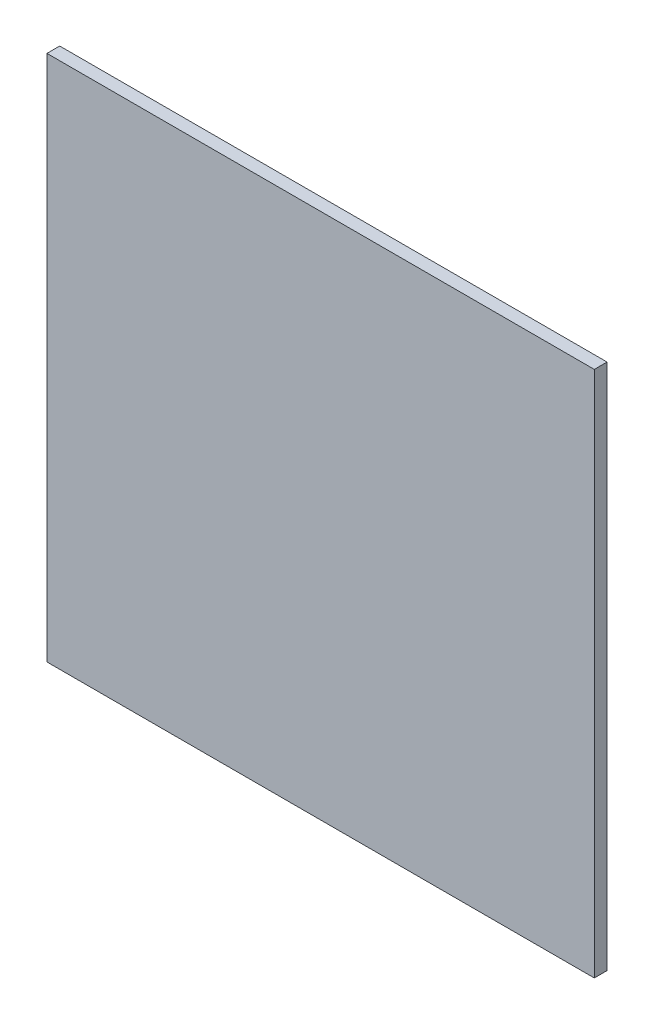
ISO-10303-21;
HEADER;
FILE_DESCRIPTION(('STEP AP214'),'2;1');
FILE_NAME('part.step','',(''),(''),'','','');
FILE_SCHEMA(('AUTOMOTIVE_DESIGN { 1 0 10303 214 1 1 1 1 }'));
ENDSEC;
DATA;
#1=APPLICATION_CONTEXT('core data for automotive mechanical design processes');
#2=APPLICATION_PROTOCOL_DEFINITION('international standard','automotive_design',2000,#1);
#3=PRODUCT_CONTEXT('',#1,'mechanical');
#4=PRODUCT('Part','Part','',(#3));
#5=PRODUCT_RELATED_PRODUCT_CATEGORY('part','',(#4));
#6=PRODUCT_DEFINITION_FORMATION('','',#4);
#7=PRODUCT_DEFINITION_CONTEXT('part definition',#1,'design');
#8=PRODUCT_DEFINITION('design','',#6,#7);
#9=PRODUCT_DEFINITION_SHAPE('','',#8);
#10=(LENGTH_UNIT() NAMED_UNIT(*) SI_UNIT(.MILLI.,.METRE.));
#11=(NAMED_UNIT(*) PLANE_ANGLE_UNIT() SI_UNIT($,.RADIAN.));
#12=(NAMED_UNIT(*) SI_UNIT($,.STERADIAN.) SOLID_ANGLE_UNIT());
#13=UNCERTAINTY_MEASURE_WITH_UNIT(LENGTH_MEASURE(1.E-05),#10,'distance_accuracy_value','');
#14=(GEOMETRIC_REPRESENTATION_CONTEXT(3) GLOBAL_UNCERTAINTY_ASSIGNED_CONTEXT((#13)) GLOBAL_UNIT_ASSIGNED_CONTEXT((#10,
#11,#12)) REPRESENTATION_CONTEXT('',''));
#15=CARTESIAN_POINT('',(0.,0.,0.));
#16=DIRECTION('',(0.,0.,1.));
#17=DIRECTION('',(1.,0.,0.));
#18=AXIS2_PLACEMENT_3D('',#15,#16,#17);
#19=CARTESIAN_POINT('',(34.29,-33.02,0.8));
#20=DIRECTION('',(-1.,0.,0.));
#21=DIRECTION('',(0.,0.,1.));
#22=AXIS2_PLACEMENT_3D('',#19,#20,#21);
#23=PLANE('',#22);
#24=DIRECTION('',(0.,1.,0.));
#25=VECTOR('',#24,1.);
#26=CARTESIAN_POINT('',(34.29,-33.02,-0.8));
#27=LINE('',#26,#25);
#28=CARTESIAN_POINT('',(34.29,-33.02,-0.8));
#29=VERTEX_POINT('',#28);
#30=CARTESIAN_POINT('',(34.29,33.02,-0.8));
#31=VERTEX_POINT('',#30);
#32=EDGE_CURVE('E99',#29,#31,#27,.T.);
#33=ORIENTED_EDGE('',*,*,#32,.T.);
#34=DIRECTION('',(0.,0.,-1.));
#35=VECTOR('',#34,1.);
#36=CARTESIAN_POINT('',(34.29,33.02,0.8));
#37=LINE('',#36,#35);
#38=CARTESIAN_POINT('',(34.29,33.02,0.8));
#39=VERTEX_POINT('',#38);
#40=EDGE_CURVE('E11',#39,#31,#37,.T.);
#41=ORIENTED_EDGE('',*,*,#40,.F.);
#42=DIRECTION('',(0.,1.,0.));
#43=VECTOR('',#42,1.);
#44=CARTESIAN_POINT('',(34.29,-33.02,0.8));
#45=LINE('',#44,#43);
#46=CARTESIAN_POINT('',(34.29,-33.02,0.8));
#47=VERTEX_POINT('',#46);
#48=EDGE_CURVE('E87',#47,#39,#45,.T.);
#49=ORIENTED_EDGE('',*,*,#48,.F.);
#50=DIRECTION('',(0.,0.,-1.));
#51=VECTOR('',#50,1.);
#52=CARTESIAN_POINT('',(34.29,-33.02,0.8));
#53=LINE('',#52,#51);
#54=EDGE_CURVE('E95',#47,#29,#53,.T.);
#55=ORIENTED_EDGE('',*,*,#54,.T.);
#56=EDGE_LOOP('',(#33,#41,#49,#55));
#57=FACE_BOUND('',#56,.T.);
#58=ADVANCED_FACE('F36',(#57),#23,.F.);
#59=CARTESIAN_POINT('',(-34.29,33.02,0.8));
#60=DIRECTION('',(0.,-1.,0.));
#61=DIRECTION('',(0.,0.,-1.));
#62=AXIS2_PLACEMENT_3D('',#59,#60,#61);
#63=PLANE('',#62);
#64=DIRECTION('',(-1.,0.,0.));
#65=VECTOR('',#64,1.);
#66=CARTESIAN_POINT('',(-34.29,33.02,-0.8));
#67=LINE('',#66,#65);
#68=CARTESIAN_POINT('',(-34.29,33.02,-0.8));
#69=VERTEX_POINT('',#68);
#70=EDGE_CURVE('E91',#31,#69,#67,.T.);
#71=ORIENTED_EDGE('',*,*,#70,.T.);
#72=DIRECTION('',(0.,0.,-1.));
#73=VECTOR('',#72,1.);
#74=CARTESIAN_POINT('',(-34.29,33.02,0.8));
#75=LINE('',#74,#73);
#76=CARTESIAN_POINT('',(-34.29,33.02,0.8));
#77=VERTEX_POINT('',#76);
#78=EDGE_CURVE('E44',#77,#69,#75,.T.);
#79=ORIENTED_EDGE('',*,*,#78,.F.);
#80=DIRECTION('',(-1.,0.,0.));
#81=VECTOR('',#80,1.);
#82=CARTESIAN_POINT('',(-34.29,33.02,0.8));
#83=LINE('',#82,#81);
#84=EDGE_CURVE('E82',#39,#77,#83,.T.);
#85=ORIENTED_EDGE('',*,*,#84,.F.);
#86=ORIENTED_EDGE('',*,*,#40,.T.);
#87=EDGE_LOOP('',(#71,#79,#85,#86));
#88=FACE_BOUND('',#87,.T.);
#89=ADVANCED_FACE('F90',(#88),#63,.F.);
#90=CARTESIAN_POINT('',(-34.29,-33.02,0.8));
#91=DIRECTION('',(1.,0.,0.));
#92=DIRECTION('',(0.,0.,-1.));
#93=AXIS2_PLACEMENT_3D('',#90,#91,#92);
#94=PLANE('',#93);
#95=DIRECTION('',(0.,-1.,0.));
#96=VECTOR('',#95,1.);
#97=CARTESIAN_POINT('',(-34.29,-33.02,-0.8));
#98=LINE('',#97,#96);
#99=CARTESIAN_POINT('',(-34.29,-33.02,-0.8));
#100=VERTEX_POINT('',#99);
#101=EDGE_CURVE('E69',#69,#100,#98,.T.);
#102=ORIENTED_EDGE('',*,*,#101,.T.);
#103=DIRECTION('',(0.,0.,-1.));
#104=VECTOR('',#103,1.);
#105=CARTESIAN_POINT('',(-34.29,-33.02,0.8));
#106=LINE('',#105,#104);
#107=CARTESIAN_POINT('',(-34.29,-33.02,0.8));
#108=VERTEX_POINT('',#107);
#109=EDGE_CURVE('E92',#108,#100,#106,.T.);
#110=ORIENTED_EDGE('',*,*,#109,.F.);
#111=DIRECTION('',(0.,-1.,0.));
#112=VECTOR('',#111,1.);
#113=CARTESIAN_POINT('',(-34.29,-33.02,0.8));
#114=LINE('',#113,#112);
#115=EDGE_CURVE('E85',#77,#108,#114,.T.);
#116=ORIENTED_EDGE('',*,*,#115,.F.);
#117=ORIENTED_EDGE('',*,*,#78,.T.);
#118=EDGE_LOOP('',(#102,#110,#116,#117));
#119=FACE_BOUND('',#118,.T.);
#120=ADVANCED_FACE('F93',(#119),#94,.F.);
#121=CARTESIAN_POINT('',(-34.29,-33.02,0.8));
#122=DIRECTION('',(0.,1.,0.));
#123=DIRECTION('',(0.,0.,1.));
#124=AXIS2_PLACEMENT_3D('',#121,#122,#123);
#125=PLANE('',#124);
#126=DIRECTION('',(1.,0.,0.));
#127=VECTOR('',#126,1.);
#128=CARTESIAN_POINT('',(-34.29,-33.02,-0.8));
#129=LINE('',#128,#127);
#130=EDGE_CURVE('E75',#100,#29,#129,.T.);
#131=ORIENTED_EDGE('',*,*,#130,.T.);
#132=ORIENTED_EDGE('',*,*,#54,.F.);
#133=DIRECTION('',(1.,0.,0.));
#134=VECTOR('',#133,1.);
#135=CARTESIAN_POINT('',(-34.29,-33.02,0.8));
#136=LINE('',#135,#134);
#137=EDGE_CURVE('E52',#108,#47,#136,.T.);
#138=ORIENTED_EDGE('',*,*,#137,.F.);
#139=ORIENTED_EDGE('',*,*,#109,.T.);
#140=EDGE_LOOP('',(#131,#132,#138,#139));
#141=FACE_BOUND('',#140,.T.);
#142=ADVANCED_FACE('F106',(#141),#125,.F.);
#143=CARTESIAN_POINT('',(0.,0.,0.8));
#144=DIRECTION('',(0.,0.,-1.));
#145=DIRECTION('',(-1.,0.,0.));
#146=AXIS2_PLACEMENT_3D('',#143,#144,#145);
#147=PLANE('',#146);
#148=ORIENTED_EDGE('',*,*,#48,.T.);
#149=ORIENTED_EDGE('',*,*,#84,.T.);
#150=ORIENTED_EDGE('',*,*,#115,.T.);
#151=ORIENTED_EDGE('',*,*,#137,.T.);
#152=EDGE_LOOP('',(#148,#149,#150,#151));
#153=FACE_BOUND('',#152,.T.);
#154=ADVANCED_FACE('F83',(#153),#147,.F.);
#155=CARTESIAN_POINT('',(0.,0.,-0.8));
#156=DIRECTION('',(0.,0.,-1.));
#157=DIRECTION('',(-1.,0.,0.));
#158=AXIS2_PLACEMENT_3D('',#155,#156,#157);
#159=PLANE('',#158);
#160=ORIENTED_EDGE('',*,*,#32,.F.);
#161=ORIENTED_EDGE('',*,*,#130,.F.);
#162=ORIENTED_EDGE('',*,*,#101,.F.);
#163=ORIENTED_EDGE('',*,*,#70,.F.);
#164=EDGE_LOOP('',(#160,#161,#162,#163));
#165=FACE_BOUND('',#164,.T.);
#166=ADVANCED_FACE('F109',(#165),#159,.T.);
#167=CLOSED_SHELL('',(#58,#89,#120,#142,#154,#166));
#168=MANIFOLD_SOLID_BREP('B2',#167);
#169=ADVANCED_BREP_SHAPE_REPRESENTATION('',(#18,#168),#14);
#170=SHAPE_DEFINITION_REPRESENTATION(#9,#169);
ENDSEC;
END-ISO-10303-21;
